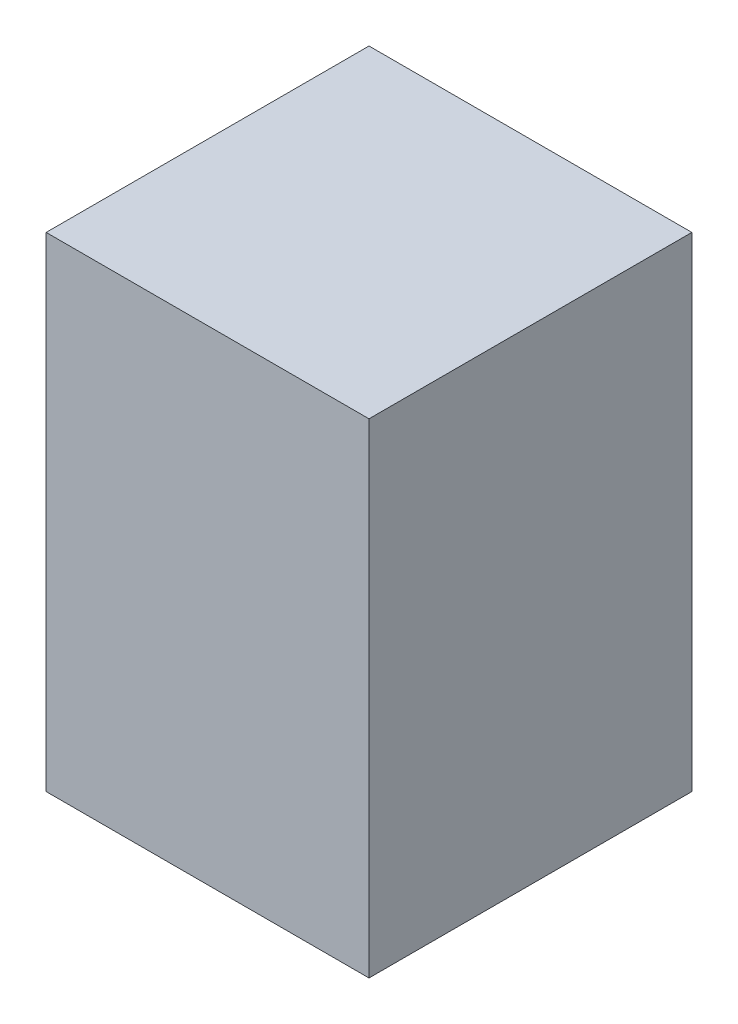
ISO-10303-21;
HEADER;
FILE_DESCRIPTION(('STEP AP214'),'2;1');
FILE_NAME('part.step','',(''),(''),'','','');
FILE_SCHEMA(('AUTOMOTIVE_DESIGN { 1 0 10303 214 1 1 1 1 }'));
ENDSEC;
DATA;
#1=APPLICATION_CONTEXT('core data for automotive mechanical design processes');
#2=APPLICATION_PROTOCOL_DEFINITION('international standard','automotive_design',2000,#1);
#3=PRODUCT_CONTEXT('',#1,'mechanical');
#4=PRODUCT('Part','Part','',(#3));
#5=PRODUCT_RELATED_PRODUCT_CATEGORY('part','',(#4));
#6=PRODUCT_DEFINITION_FORMATION('','',#4);
#7=PRODUCT_DEFINITION_CONTEXT('part definition',#1,'design');
#8=PRODUCT_DEFINITION('design','',#6,#7);
#9=PRODUCT_DEFINITION_SHAPE('','',#8);
#10=(LENGTH_UNIT() NAMED_UNIT(*) SI_UNIT(.MILLI.,.METRE.));
#11=(NAMED_UNIT(*) PLANE_ANGLE_UNIT() SI_UNIT($,.RADIAN.));
#12=(NAMED_UNIT(*) SI_UNIT($,.STERADIAN.) SOLID_ANGLE_UNIT());
#13=UNCERTAINTY_MEASURE_WITH_UNIT(LENGTH_MEASURE(1.E-05),#10,'distance_accuracy_value','');
#14=(GEOMETRIC_REPRESENTATION_CONTEXT(3) GLOBAL_UNCERTAINTY_ASSIGNED_CONTEXT((#13)) GLOBAL_UNIT_ASSIGNED_CONTEXT((#10,
#11,#12)) REPRESENTATION_CONTEXT('',''));
#15=CARTESIAN_POINT('',(0.,0.,0.));
#16=DIRECTION('',(0.,0.,1.));
#17=DIRECTION('',(1.,0.,0.));
#18=AXIS2_PLACEMENT_3D('',#15,#16,#17);
#19=CARTESIAN_POINT('',(560.,0.,-120.));
#20=DIRECTION('',(-1.,0.,0.));
#21=DIRECTION('',(0.,0.,1.));
#22=AXIS2_PLACEMENT_3D('',#19,#20,#21);
#23=PLANE('',#22);
#24=DIRECTION('',(0.,-1.,0.));
#25=VECTOR('',#24,1.);
#26=CARTESIAN_POINT('',(560.,0.,-40.));
#27=LINE('',#26,#25);
#28=CARTESIAN_POINT('',(560.,120.,-40.));
#29=VERTEX_POINT('',#28);
#30=CARTESIAN_POINT('',(560.,0.,-40.));
#31=VERTEX_POINT('',#30);
#32=EDGE_CURVE('E103',#29,#31,#27,.T.);
#33=ORIENTED_EDGE('',*,*,#32,.F.);
#34=DIRECTION('',(0.,0.,1.));
#35=VECTOR('',#34,1.);
#36=CARTESIAN_POINT('',(560.,120.,-120.));
#37=LINE('',#36,#35);
#38=CARTESIAN_POINT('',(560.,120.,-120.));
#39=VERTEX_POINT('',#38);
#40=EDGE_CURVE('E11',#39,#29,#37,.T.);
#41=ORIENTED_EDGE('',*,*,#40,.F.);
#42=DIRECTION('',(0.,-1.,0.));
#43=VECTOR('',#42,1.);
#44=CARTESIAN_POINT('',(560.,0.,-120.));
#45=LINE('',#44,#43);
#46=CARTESIAN_POINT('',(560.,0.,-120.));
#47=VERTEX_POINT('',#46);
#48=EDGE_CURVE('E97',#39,#47,#45,.T.);
#49=ORIENTED_EDGE('',*,*,#48,.T.);
#50=DIRECTION('',(0.,0.,1.));
#51=VECTOR('',#50,1.);
#52=CARTESIAN_POINT('',(560.,0.,-120.));
#53=LINE('',#52,#51);
#54=EDGE_CURVE('E42',#47,#31,#53,.T.);
#55=ORIENTED_EDGE('',*,*,#54,.T.);
#56=EDGE_LOOP('',(#33,#41,#49,#55));
#57=FACE_BOUND('',#56,.T.);
#58=ADVANCED_FACE('F39',(#57),#23,.T.);
#59=CARTESIAN_POINT('',(560.,120.,-120.));
#60=DIRECTION('',(0.,1.,0.));
#61=DIRECTION('',(0.,0.,1.));
#62=AXIS2_PLACEMENT_3D('',#59,#60,#61);
#63=PLANE('',#62);
#64=DIRECTION('',(-1.,0.,0.));
#65=VECTOR('',#64,1.);
#66=CARTESIAN_POINT('',(560.,120.,-40.));
#67=LINE('',#66,#65);
#68=CARTESIAN_POINT('',(640.,120.,-40.));
#69=VERTEX_POINT('',#68);
#70=EDGE_CURVE('E99',#69,#29,#67,.T.);
#71=ORIENTED_EDGE('',*,*,#70,.F.);
#72=DIRECTION('',(0.,0.,1.));
#73=VECTOR('',#72,1.);
#74=CARTESIAN_POINT('',(640.,120.,-120.));
#75=LINE('',#74,#73);
#76=CARTESIAN_POINT('',(640.,120.,-120.));
#77=VERTEX_POINT('',#76);
#78=EDGE_CURVE('E48',#77,#69,#75,.T.);
#79=ORIENTED_EDGE('',*,*,#78,.F.);
#80=DIRECTION('',(-1.,0.,0.));
#81=VECTOR('',#80,1.);
#82=CARTESIAN_POINT('',(560.,120.,-120.));
#83=LINE('',#82,#81);
#84=EDGE_CURVE('E94',#77,#39,#83,.T.);
#85=ORIENTED_EDGE('',*,*,#84,.T.);
#86=ORIENTED_EDGE('',*,*,#40,.T.);
#87=EDGE_LOOP('',(#71,#79,#85,#86));
#88=FACE_BOUND('',#87,.T.);
#89=ADVANCED_FACE('F113',(#88),#63,.T.);
#90=CARTESIAN_POINT('',(640.,0.,-120.));
#91=DIRECTION('',(1.,0.,0.));
#92=DIRECTION('',(0.,0.,-1.));
#93=AXIS2_PLACEMENT_3D('',#90,#91,#92);
#94=PLANE('',#93);
#95=DIRECTION('',(0.,1.,0.));
#96=VECTOR('',#95,1.);
#97=CARTESIAN_POINT('',(640.,0.,-40.));
#98=LINE('',#97,#96);
#99=CARTESIAN_POINT('',(640.,0.,-40.));
#100=VERTEX_POINT('',#99);
#101=EDGE_CURVE('E89',#100,#69,#98,.T.);
#102=ORIENTED_EDGE('',*,*,#101,.F.);
#103=DIRECTION('',(0.,0.,1.));
#104=VECTOR('',#103,1.);
#105=CARTESIAN_POINT('',(640.,0.,-120.));
#106=LINE('',#105,#104);
#107=CARTESIAN_POINT('',(640.,0.,-120.));
#108=VERTEX_POINT('',#107);
#109=EDGE_CURVE('E84',#108,#100,#106,.T.);
#110=ORIENTED_EDGE('',*,*,#109,.F.);
#111=DIRECTION('',(0.,1.,0.));
#112=VECTOR('',#111,1.);
#113=CARTESIAN_POINT('',(640.,0.,-120.));
#114=LINE('',#113,#112);
#115=EDGE_CURVE('E87',#108,#77,#114,.T.);
#116=ORIENTED_EDGE('',*,*,#115,.T.);
#117=ORIENTED_EDGE('',*,*,#78,.T.);
#118=EDGE_LOOP('',(#102,#110,#116,#117));
#119=FACE_BOUND('',#118,.T.);
#120=ADVANCED_FACE('F86',(#119),#94,.T.);
#121=CARTESIAN_POINT('',(560.,0.,-120.));
#122=DIRECTION('',(0.,-1.,0.));
#123=DIRECTION('',(0.,0.,-1.));
#124=AXIS2_PLACEMENT_3D('',#121,#122,#123);
#125=PLANE('',#124);
#126=DIRECTION('',(1.,0.,0.));
#127=VECTOR('',#126,1.);
#128=CARTESIAN_POINT('',(560.,0.,-40.));
#129=LINE('',#128,#127);
#130=EDGE_CURVE('E106',#31,#100,#129,.T.);
#131=ORIENTED_EDGE('',*,*,#130,.F.);
#132=ORIENTED_EDGE('',*,*,#54,.F.);
#133=DIRECTION('',(1.,0.,0.));
#134=VECTOR('',#133,1.);
#135=CARTESIAN_POINT('',(560.,0.,-120.));
#136=LINE('',#135,#134);
#137=EDGE_CURVE('E93',#47,#108,#136,.T.);
#138=ORIENTED_EDGE('',*,*,#137,.T.);
#139=ORIENTED_EDGE('',*,*,#109,.T.);
#140=EDGE_LOOP('',(#131,#132,#138,#139));
#141=FACE_BOUND('',#140,.T.);
#142=ADVANCED_FACE('F96',(#141),#125,.T.);
#143=CARTESIAN_POINT('',(0.,0.,-120.));
#144=DIRECTION('',(0.,0.,-1.));
#145=DIRECTION('',(-1.,0.,0.));
#146=AXIS2_PLACEMENT_3D('',#143,#144,#145);
#147=PLANE('',#146);
#148=ORIENTED_EDGE('',*,*,#48,.F.);
#149=ORIENTED_EDGE('',*,*,#84,.F.);
#150=ORIENTED_EDGE('',*,*,#115,.F.);
#151=ORIENTED_EDGE('',*,*,#137,.F.);
#152=EDGE_LOOP('',(#148,#149,#150,#151));
#153=FACE_BOUND('',#152,.T.);
#154=ADVANCED_FACE('F92',(#153),#147,.T.);
#155=CARTESIAN_POINT('',(0.,0.,-40.));
#156=DIRECTION('',(0.,0.,-1.));
#157=DIRECTION('',(-1.,0.,0.));
#158=AXIS2_PLACEMENT_3D('',#155,#156,#157);
#159=PLANE('',#158);
#160=ORIENTED_EDGE('',*,*,#32,.T.);
#161=ORIENTED_EDGE('',*,*,#130,.T.);
#162=ORIENTED_EDGE('',*,*,#101,.T.);
#163=ORIENTED_EDGE('',*,*,#70,.T.);
#164=EDGE_LOOP('',(#160,#161,#162,#163));
#165=FACE_BOUND('',#164,.T.);
#166=ADVANCED_FACE('F112',(#165),#159,.F.);
#167=CLOSED_SHELL('',(#58,#89,#120,#142,#154,#166));
#168=MANIFOLD_SOLID_BREP('B2',#167);
#169=ADVANCED_BREP_SHAPE_REPRESENTATION('',(#18,#168),#14);
#170=SHAPE_DEFINITION_REPRESENTATION(#9,#169);
ENDSEC;
END-ISO-10303-21;
